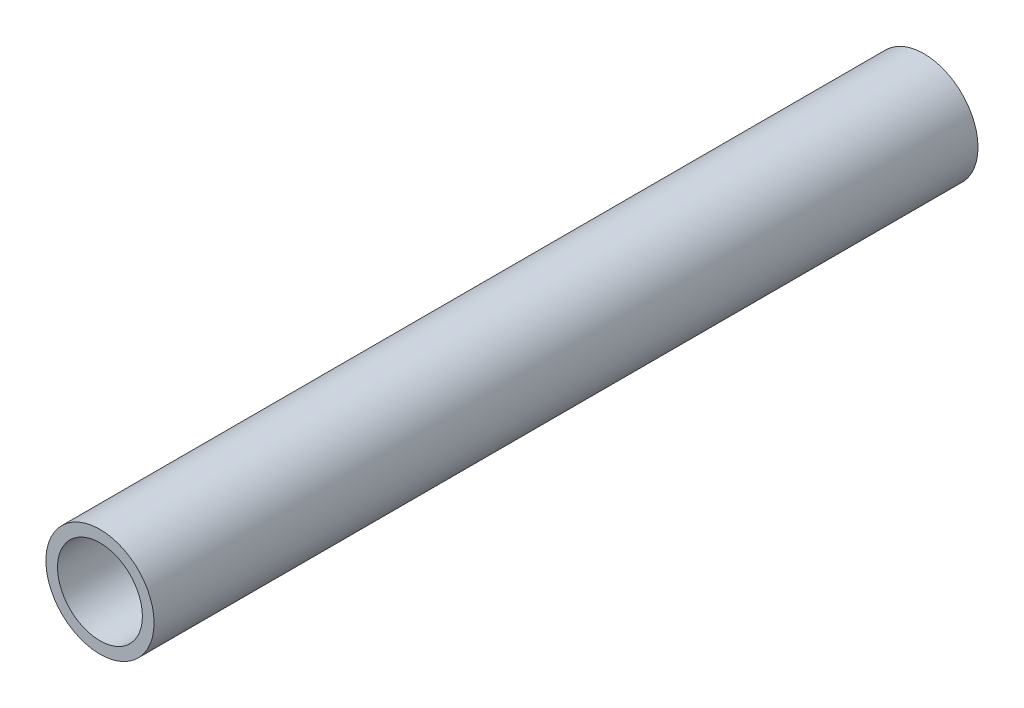
ISO-10303-21;
HEADER;
FILE_DESCRIPTION(('STEP AP214'),'2;1');
FILE_NAME('part.step','',(''),(''),'','','');
FILE_SCHEMA(('AUTOMOTIVE_DESIGN { 1 0 10303 214 1 1 1 1 }'));
ENDSEC;
DATA;
#1=APPLICATION_CONTEXT('core data for automotive mechanical design processes');
#2=APPLICATION_PROTOCOL_DEFINITION('international standard','automotive_design',2000,#1);
#3=PRODUCT_CONTEXT('',#1,'mechanical');
#4=PRODUCT('Part','Part','',(#3));
#5=PRODUCT_RELATED_PRODUCT_CATEGORY('part','',(#4));
#6=PRODUCT_DEFINITION_FORMATION('','',#4);
#7=PRODUCT_DEFINITION_CONTEXT('part definition',#1,'design');
#8=PRODUCT_DEFINITION('design','',#6,#7);
#9=PRODUCT_DEFINITION_SHAPE('','',#8);
#10=(LENGTH_UNIT() NAMED_UNIT(*) SI_UNIT(.MILLI.,.METRE.));
#11=(NAMED_UNIT(*) PLANE_ANGLE_UNIT() SI_UNIT($,.RADIAN.));
#12=(NAMED_UNIT(*) SI_UNIT($,.STERADIAN.) SOLID_ANGLE_UNIT());
#13=UNCERTAINTY_MEASURE_WITH_UNIT(LENGTH_MEASURE(1.E-05),#10,'distance_accuracy_value','');
#14=(GEOMETRIC_REPRESENTATION_CONTEXT(3) GLOBAL_UNCERTAINTY_ASSIGNED_CONTEXT((#13)) GLOBAL_UNIT_ASSIGNED_CONTEXT((#10,
#11,#12)) REPRESENTATION_CONTEXT('',''));
#15=CARTESIAN_POINT('',(0.,0.,0.));
#16=DIRECTION('',(0.,0.,1.));
#17=DIRECTION('',(1.,0.,0.));
#18=AXIS2_PLACEMENT_3D('',#15,#16,#17);
#19=CARTESIAN_POINT('',(0.,0.,203.2));
#20=DIRECTION('',(0.,0.,1.));
#21=DIRECTION('',(1.,0.,0.));
#22=AXIS2_PLACEMENT_3D('',#19,#20,#21);
#23=PLANE('',#22);
#24=CARTESIAN_POINT('',(0.,0.,203.2));
#25=DIRECTION('',(0.,0.,1.));
#26=DIRECTION('',(1.,0.,0.));
#27=AXIS2_PLACEMENT_3D('',#24,#25,#26);
#28=CIRCLE('',#27,13.335);
#29=CARTESIAN_POINT('',(13.335,0.,203.2));
#30=VERTEX_POINT('',#29);
#31=EDGE_CURVE('E10',#30,#30,#28,.T.);
#32=ORIENTED_EDGE('',*,*,#31,.T.);
#33=EDGE_LOOP('',(#32));
#34=FACE_BOUND('',#33,.T.);
#35=CARTESIAN_POINT('',(0.,0.,203.2));
#36=DIRECTION('',(0.,0.,1.));
#37=DIRECTION('',(1.,0.,0.));
#38=AXIS2_PLACEMENT_3D('',#35,#36,#37);
#39=CIRCLE('',#38,10.4648);
#40=CARTESIAN_POINT('',(10.4648,0.,203.2));
#41=VERTEX_POINT('',#40);
#42=EDGE_CURVE('E46',#41,#41,#39,.T.);
#43=ORIENTED_EDGE('',*,*,#42,.F.);
#44=EDGE_LOOP('',(#43));
#45=FACE_BOUND('',#44,.T.);
#46=ADVANCED_FACE('F35',(#34,#45),#23,.T.);
#47=CARTESIAN_POINT('',(0.,0.,0.));
#48=DIRECTION('',(0.,0.,1.));
#49=DIRECTION('',(1.,0.,0.));
#50=AXIS2_PLACEMENT_3D('',#47,#48,#49);
#51=PLANE('',#50);
#52=CARTESIAN_POINT('',(0.,0.,0.));
#53=DIRECTION('',(0.,0.,1.));
#54=DIRECTION('',(1.,0.,0.));
#55=AXIS2_PLACEMENT_3D('',#52,#53,#54);
#56=CIRCLE('',#55,13.335);
#57=CARTESIAN_POINT('',(13.335,0.,0.));
#58=VERTEX_POINT('',#57);
#59=EDGE_CURVE('E39',#58,#58,#56,.T.);
#60=ORIENTED_EDGE('',*,*,#59,.F.);
#61=EDGE_LOOP('',(#60));
#62=FACE_BOUND('',#61,.T.);
#63=CARTESIAN_POINT('',(0.,0.,0.));
#64=DIRECTION('',(0.,0.,1.));
#65=DIRECTION('',(1.,0.,0.));
#66=AXIS2_PLACEMENT_3D('',#63,#64,#65);
#67=CIRCLE('',#66,10.4648);
#68=CARTESIAN_POINT('',(10.4648,0.,0.));
#69=VERTEX_POINT('',#68);
#70=EDGE_CURVE('E48',#69,#69,#67,.T.);
#71=ORIENTED_EDGE('',*,*,#70,.T.);
#72=EDGE_LOOP('',(#71));
#73=FACE_BOUND('',#72,.T.);
#74=ADVANCED_FACE('F58',(#62,#73),#51,.F.);
#75=CARTESIAN_POINT('',(0.,0.,203.2));
#76=DIRECTION('',(0.,0.,-1.));
#77=DIRECTION('',(-1.,0.,0.));
#78=AXIS2_PLACEMENT_3D('',#75,#76,#77);
#79=CYLINDRICAL_SURFACE('',#78,13.335);
#80=ORIENTED_EDGE('',*,*,#31,.F.);
#81=EDGE_LOOP('',(#80));
#82=FACE_BOUND('',#81,.T.);
#83=ORIENTED_EDGE('',*,*,#59,.T.);
#84=EDGE_LOOP('',(#83));
#85=FACE_BOUND('',#84,.T.);
#86=ADVANCED_FACE('F37',(#82,#85),#79,.T.);
#87=CARTESIAN_POINT('',(0.,0.,203.2));
#88=DIRECTION('',(0.,0.,-1.));
#89=DIRECTION('',(-1.,0.,0.));
#90=AXIS2_PLACEMENT_3D('',#87,#88,#89);
#91=CYLINDRICAL_SURFACE('',#90,10.4648);
#92=ORIENTED_EDGE('',*,*,#42,.T.);
#93=EDGE_LOOP('',(#92));
#94=FACE_BOUND('',#93,.T.);
#95=ORIENTED_EDGE('',*,*,#70,.F.);
#96=EDGE_LOOP('',(#95));
#97=FACE_BOUND('',#96,.T.);
#98=ADVANCED_FACE('F54',(#94,#97),#91,.F.);
#99=CLOSED_SHELL('',(#46,#74,#86,#98));
#100=MANIFOLD_SOLID_BREP('B2',#99);
#101=ADVANCED_BREP_SHAPE_REPRESENTATION('',(#18,#100),#14);
#102=SHAPE_DEFINITION_REPRESENTATION(#9,#101);
ENDSEC;
END-ISO-10303-21;
